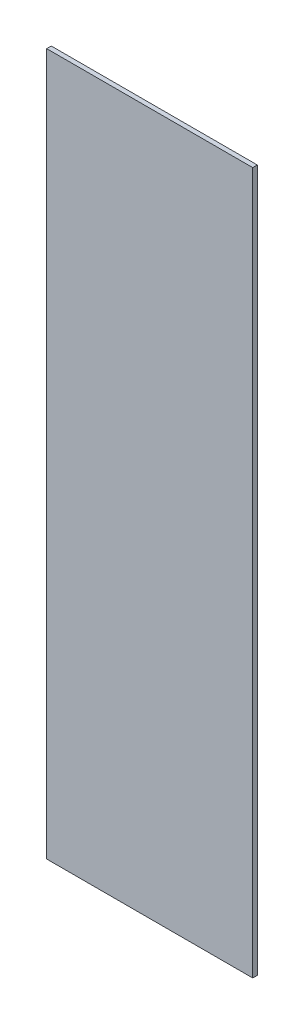
ISO-10303-21;
HEADER;
FILE_DESCRIPTION(('STEP AP214'),'2;1');
FILE_NAME('part.step','',(''),(''),'','','');
FILE_SCHEMA(('AUTOMOTIVE_DESIGN { 1 0 10303 214 1 1 1 1 }'));
ENDSEC;
DATA;
#1=APPLICATION_CONTEXT('core data for automotive mechanical design processes');
#2=APPLICATION_PROTOCOL_DEFINITION('international standard','automotive_design',2000,#1);
#3=PRODUCT_CONTEXT('',#1,'mechanical');
#4=PRODUCT('Part','Part','',(#3));
#5=PRODUCT_RELATED_PRODUCT_CATEGORY('part','',(#4));
#6=PRODUCT_DEFINITION_FORMATION('','',#4);
#7=PRODUCT_DEFINITION_CONTEXT('part definition',#1,'design');
#8=PRODUCT_DEFINITION('design','',#6,#7);
#9=PRODUCT_DEFINITION_SHAPE('','',#8);
#10=(LENGTH_UNIT() NAMED_UNIT(*) SI_UNIT(.MILLI.,.METRE.));
#11=(NAMED_UNIT(*) PLANE_ANGLE_UNIT() SI_UNIT($,.RADIAN.));
#12=(NAMED_UNIT(*) SI_UNIT($,.STERADIAN.) SOLID_ANGLE_UNIT());
#13=UNCERTAINTY_MEASURE_WITH_UNIT(LENGTH_MEASURE(1.E-05),#10,'distance_accuracy_value','');
#14=(GEOMETRIC_REPRESENTATION_CONTEXT(3) GLOBAL_UNCERTAINTY_ASSIGNED_CONTEXT((#13)) GLOBAL_UNIT_ASSIGNED_CONTEXT((#10,
#11,#12)) REPRESENTATION_CONTEXT('',''));
#15=CARTESIAN_POINT('',(0.,0.,0.));
#16=DIRECTION('',(0.,0.,1.));
#17=DIRECTION('',(1.,0.,0.));
#18=AXIS2_PLACEMENT_3D('',#15,#16,#17);
#19=CARTESIAN_POINT('',(0.67499992,-2.29941882,0.));
#20=DIRECTION('',(-1.,0.,0.));
#21=DIRECTION('',(0.,1.,0.));
#22=AXIS2_PLACEMENT_3D('',#19,#20,#21);
#23=PLANE('',#22);
#24=DIRECTION('',(0.,1.,0.));
#25=VECTOR('',#24,1.);
#26=CARTESIAN_POINT('',(0.67499992,-2.29941882,0.));
#27=LINE('',#26,#25);
#28=CARTESIAN_POINT('',(0.67499992,-2.29941882,0.));
#29=VERTEX_POINT('',#28);
#30=CARTESIAN_POINT('',(0.67499992,2.29941882,0.));
#31=VERTEX_POINT('',#30);
#32=EDGE_CURVE('E11',#29,#31,#27,.T.);
#33=ORIENTED_EDGE('',*,*,#32,.T.);
#34=DIRECTION('',(0.,0.,1.));
#35=VECTOR('',#34,1.);
#36=CARTESIAN_POINT('',(0.67499992,2.29941882,0.));
#37=LINE('',#36,#35);
#38=CARTESIAN_POINT('',(0.67499992,2.29941882,0.02999994));
#39=VERTEX_POINT('',#38);
#40=EDGE_CURVE('E24',#31,#39,#37,.T.);
#41=ORIENTED_EDGE('',*,*,#40,.T.);
#42=DIRECTION('',(0.,1.,0.));
#43=VECTOR('',#42,1.);
#44=CARTESIAN_POINT('',(0.67499992,-2.29941882,0.02999994));
#45=LINE('',#44,#43);
#46=CARTESIAN_POINT('',(0.67499992,-2.29941882,0.02999994));
#47=VERTEX_POINT('',#46);
#48=EDGE_CURVE('E87',#47,#39,#45,.T.);
#49=ORIENTED_EDGE('',*,*,#48,.F.);
#50=DIRECTION('',(0.,0.,1.));
#51=VECTOR('',#50,1.);
#52=CARTESIAN_POINT('',(0.67499992,-2.29941882,0.));
#53=LINE('',#52,#51);
#54=EDGE_CURVE('E36',#29,#47,#53,.T.);
#55=ORIENTED_EDGE('',*,*,#54,.F.);
#56=EDGE_LOOP('',(#33,#41,#49,#55));
#57=FACE_BOUND('',#56,.T.);
#58=ADVANCED_FACE('F17',(#57),#23,.F.);
#59=CARTESIAN_POINT('',(0.67499992,2.29941882,0.));
#60=DIRECTION('',(0.,-1.,0.));
#61=DIRECTION('',(-1.,0.,0.));
#62=AXIS2_PLACEMENT_3D('',#59,#60,#61);
#63=PLANE('',#62);
#64=DIRECTION('',(-1.,0.,0.));
#65=VECTOR('',#64,1.);
#66=CARTESIAN_POINT('',(0.67499992,2.29941882,0.));
#67=LINE('',#66,#65);
#68=CARTESIAN_POINT('',(-0.67499992,2.29941882,0.));
#69=VERTEX_POINT('',#68);
#70=EDGE_CURVE('E84',#31,#69,#67,.T.);
#71=ORIENTED_EDGE('',*,*,#70,.T.);
#72=DIRECTION('',(0.,0.,1.));
#73=VECTOR('',#72,1.);
#74=CARTESIAN_POINT('',(-0.67499992,2.29941882,0.));
#75=LINE('',#74,#73);
#76=CARTESIAN_POINT('',(-0.67499992,2.29941882,0.02999994));
#77=VERTEX_POINT('',#76);
#78=EDGE_CURVE('E82',#69,#77,#75,.T.);
#79=ORIENTED_EDGE('',*,*,#78,.T.);
#80=DIRECTION('',(-1.,0.,0.));
#81=VECTOR('',#80,1.);
#82=CARTESIAN_POINT('',(0.67499992,2.29941882,0.02999994));
#83=LINE('',#82,#81);
#84=EDGE_CURVE('E62',#39,#77,#83,.T.);
#85=ORIENTED_EDGE('',*,*,#84,.F.);
#86=ORIENTED_EDGE('',*,*,#40,.F.);
#87=EDGE_LOOP('',(#71,#79,#85,#86));
#88=FACE_BOUND('',#87,.T.);
#89=ADVANCED_FACE('F89',(#88),#63,.F.);
#90=CARTESIAN_POINT('',(-0.67499992,2.29941882,0.));
#91=DIRECTION('',(1.,0.,0.));
#92=DIRECTION('',(0.,-1.,0.));
#93=AXIS2_PLACEMENT_3D('',#90,#91,#92);
#94=PLANE('',#93);
#95=DIRECTION('',(0.,-1.,0.));
#96=VECTOR('',#95,1.);
#97=CARTESIAN_POINT('',(-0.67499992,2.29941882,0.));
#98=LINE('',#97,#96);
#99=CARTESIAN_POINT('',(-0.67499992,-2.29941882,0.));
#100=VERTEX_POINT('',#99);
#101=EDGE_CURVE('E71',#69,#100,#98,.T.);
#102=ORIENTED_EDGE('',*,*,#101,.T.);
#103=DIRECTION('',(0.,0.,1.));
#104=VECTOR('',#103,1.);
#105=CARTESIAN_POINT('',(-0.67499992,-2.29941882,0.));
#106=LINE('',#105,#104);
#107=CARTESIAN_POINT('',(-0.67499992,-2.29941882,0.02999994));
#108=VERTEX_POINT('',#107);
#109=EDGE_CURVE('E65',#100,#108,#106,.T.);
#110=ORIENTED_EDGE('',*,*,#109,.T.);
#111=DIRECTION('',(0.,-1.,0.));
#112=VECTOR('',#111,1.);
#113=CARTESIAN_POINT('',(-0.67499992,2.29941882,0.02999994));
#114=LINE('',#113,#112);
#115=EDGE_CURVE('E57',#77,#108,#114,.T.);
#116=ORIENTED_EDGE('',*,*,#115,.F.);
#117=ORIENTED_EDGE('',*,*,#78,.F.);
#118=EDGE_LOOP('',(#102,#110,#116,#117));
#119=FACE_BOUND('',#118,.T.);
#120=ADVANCED_FACE('F69',(#119),#94,.F.);
#121=CARTESIAN_POINT('',(-0.67499992,-2.29941882,0.));
#122=DIRECTION('',(0.,1.,0.));
#123=DIRECTION('',(1.,0.,0.));
#124=AXIS2_PLACEMENT_3D('',#121,#122,#123);
#125=PLANE('',#124);
#126=DIRECTION('',(1.,0.,0.));
#127=VECTOR('',#126,1.);
#128=CARTESIAN_POINT('',(-0.67499992,-2.29941882,0.));
#129=LINE('',#128,#127);
#130=EDGE_CURVE('E66',#100,#29,#129,.T.);
#131=ORIENTED_EDGE('',*,*,#130,.T.);
#132=ORIENTED_EDGE('',*,*,#54,.T.);
#133=DIRECTION('',(1.,0.,0.));
#134=VECTOR('',#133,1.);
#135=CARTESIAN_POINT('',(-0.67499992,-2.29941882,0.02999994));
#136=LINE('',#135,#134);
#137=EDGE_CURVE('E61',#108,#47,#136,.T.);
#138=ORIENTED_EDGE('',*,*,#137,.F.);
#139=ORIENTED_EDGE('',*,*,#109,.F.);
#140=EDGE_LOOP('',(#131,#132,#138,#139));
#141=FACE_BOUND('',#140,.T.);
#142=ADVANCED_FACE('F76',(#141),#125,.F.);
#143=CARTESIAN_POINT('',(0.,0.,0.));
#144=DIRECTION('',(0.,0.,1.));
#145=DIRECTION('',(1.,0.,0.));
#146=AXIS2_PLACEMENT_3D('',#143,#144,#145);
#147=PLANE('',#146);
#148=ORIENTED_EDGE('',*,*,#130,.F.);
#149=ORIENTED_EDGE('',*,*,#101,.F.);
#150=ORIENTED_EDGE('',*,*,#70,.F.);
#151=ORIENTED_EDGE('',*,*,#32,.F.);
#152=EDGE_LOOP('',(#148,#149,#150,#151));
#153=FACE_BOUND('',#152,.T.);
#154=ADVANCED_FACE('F91',(#153),#147,.F.);
#155=CARTESIAN_POINT('',(0.,0.,0.02999994));
#156=DIRECTION('',(0.,0.,1.));
#157=DIRECTION('',(1.,0.,0.));
#158=AXIS2_PLACEMENT_3D('',#155,#156,#157);
#159=PLANE('',#158);
#160=ORIENTED_EDGE('',*,*,#48,.T.);
#161=ORIENTED_EDGE('',*,*,#84,.T.);
#162=ORIENTED_EDGE('',*,*,#115,.T.);
#163=ORIENTED_EDGE('',*,*,#137,.T.);
#164=EDGE_LOOP('',(#160,#161,#162,#163));
#165=FACE_BOUND('',#164,.T.);
#166=ADVANCED_FACE('F59',(#165),#159,.T.);
#167=CLOSED_SHELL('',(#58,#89,#120,#142,#154,#166));
#168=MANIFOLD_SOLID_BREP('B1',#167);
#169=ADVANCED_BREP_SHAPE_REPRESENTATION('',(#18,#168),#14);
#170=SHAPE_DEFINITION_REPRESENTATION(#9,#169);
ENDSEC;
END-ISO-10303-21;
